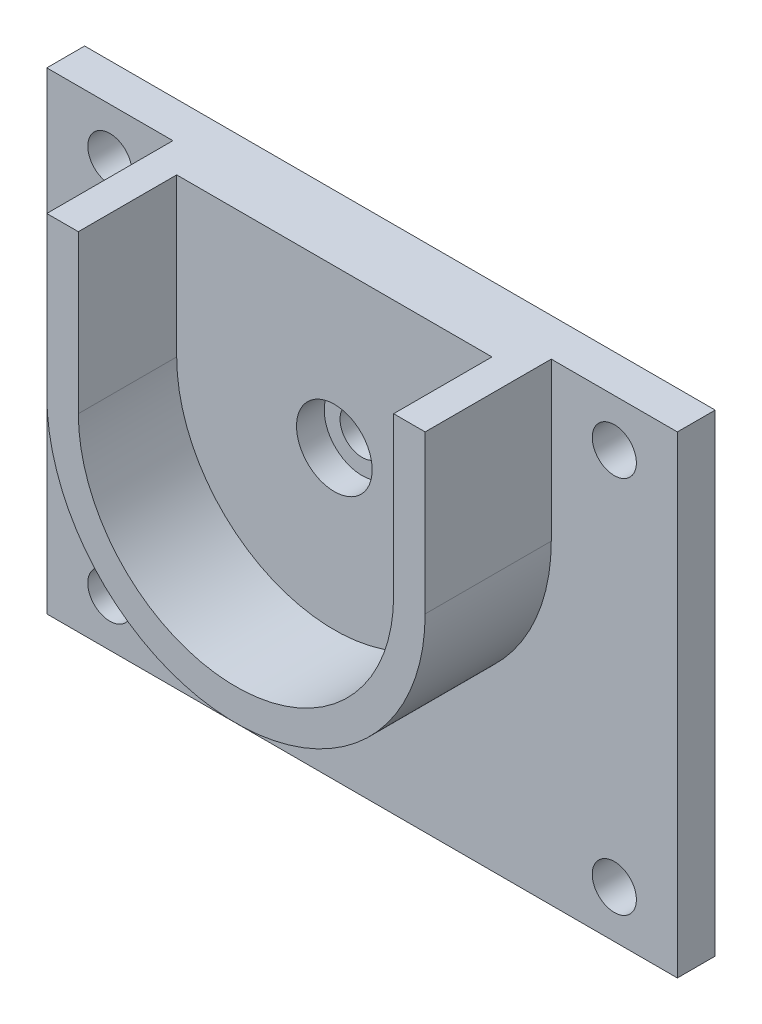
ISO-10303-21;
HEADER;
FILE_DESCRIPTION(('STEP AP214'),'2;1');
FILE_NAME('part.step','',(''),(''),'','','');
FILE_SCHEMA(('AUTOMOTIVE_DESIGN { 1 0 10303 214 1 1 1 1 }'));
ENDSEC;
DATA;
#1=APPLICATION_CONTEXT('core data for automotive mechanical design processes');
#2=APPLICATION_PROTOCOL_DEFINITION('international standard','automotive_design',2000,#1);
#3=PRODUCT_CONTEXT('',#1,'mechanical');
#4=PRODUCT('Part','Part','',(#3));
#5=PRODUCT_RELATED_PRODUCT_CATEGORY('part','',(#4));
#6=PRODUCT_DEFINITION_FORMATION('','',#4);
#7=PRODUCT_DEFINITION_CONTEXT('part definition',#1,'design');
#8=PRODUCT_DEFINITION('design','',#6,#7);
#9=PRODUCT_DEFINITION_SHAPE('','',#8);
#10=(LENGTH_UNIT() NAMED_UNIT(*) SI_UNIT(.MILLI.,.METRE.));
#11=(NAMED_UNIT(*) PLANE_ANGLE_UNIT() SI_UNIT($,.RADIAN.));
#12=(NAMED_UNIT(*) SI_UNIT($,.STERADIAN.) SOLID_ANGLE_UNIT());
#13=UNCERTAINTY_MEASURE_WITH_UNIT(LENGTH_MEASURE(1.E-05),#10,'distance_accuracy_value','');
#14=(GEOMETRIC_REPRESENTATION_CONTEXT(3) GLOBAL_UNCERTAINTY_ASSIGNED_CONTEXT((#13)) GLOBAL_UNIT_ASSIGNED_CONTEXT((#10,
#11,#12)) REPRESENTATION_CONTEXT('',''));
#15=CARTESIAN_POINT('',(0.,0.,0.));
#16=DIRECTION('',(0.,0.,1.));
#17=DIRECTION('',(1.,0.,0.));
#18=AXIS2_PLACEMENT_3D('',#15,#16,#17);
#19=CARTESIAN_POINT('',(0.,0.,3.));
#20=DIRECTION('',(0.,0.,1.));
#21=DIRECTION('',(1.,0.,0.));
#22=AXIS2_PLACEMENT_3D('',#19,#20,#21);
#23=PLANE('',#22);
#24=CARTESIAN_POINT('',(0.,0.,3.));
#25=DIRECTION('',(0.,0.,1.));
#26=DIRECTION('',(1.,0.,0.));
#27=AXIS2_PLACEMENT_3D('',#24,#25,#26);
#28=CIRCLE('',#27,1.75);
#29=CARTESIAN_POINT('',(1.75,0.,3.));
#30=VERTEX_POINT('',#29);
#31=EDGE_CURVE('E196',#30,#30,#28,.T.);
#32=ORIENTED_EDGE('',*,*,#31,.F.);
#33=EDGE_LOOP('',(#32));
#34=FACE_BOUND('',#33,.T.);
#35=CARTESIAN_POINT('',(0.,0.,3.));
#36=DIRECTION('',(0.,0.,1.));
#37=DIRECTION('',(1.,0.,0.));
#38=AXIS2_PLACEMENT_3D('',#35,#36,#37);
#39=CIRCLE('',#38,3.);
#40=CARTESIAN_POINT('',(3.,0.,3.));
#41=VERTEX_POINT('',#40);
#42=EDGE_CURVE('E11',#41,#41,#39,.F.);
#43=ORIENTED_EDGE('',*,*,#42,.F.);
#44=EDGE_LOOP('',(#43));
#45=FACE_BOUND('',#44,.T.);
#46=ADVANCED_FACE('F41',(#34,#45),#23,.T.);
#47=DIRECTION('',(0.,1.,0.));
#48=VECTOR('',#47,1.);
#49=CARTESIAN_POINT('',(15.,0.,3.));
#50=LINE('',#49,#48);
#51=CARTESIAN_POINT('',(15.,0.,3.));
#52=VERTEX_POINT('',#51);
#53=CARTESIAN_POINT('',(15.,12.5,3.));
#54=VERTEX_POINT('',#53);
#55=EDGE_CURVE('E148',#52,#54,#50,.T.);
#56=ORIENTED_EDGE('',*,*,#55,.F.);
#57=CARTESIAN_POINT('',(0.,0.,3.));
#58=DIRECTION('',(0.,0.,1.));
#59=DIRECTION('',(1.,0.,0.));
#60=AXIS2_PLACEMENT_3D('',#57,#58,#59);
#61=CIRCLE('',#60,15.);
#62=CARTESIAN_POINT('',(-15.,0.,3.));
#63=VERTEX_POINT('',#62);
#64=EDGE_CURVE('E291',#63,#52,#61,.T.);
#65=ORIENTED_EDGE('',*,*,#64,.F.);
#66=DIRECTION('',(0.,-1.,0.));
#67=VECTOR('',#66,1.);
#68=CARTESIAN_POINT('',(-15.,0.,3.));
#69=LINE('',#68,#67);
#70=CARTESIAN_POINT('',(-15.,12.5,3.));
#71=VERTEX_POINT('',#70);
#72=EDGE_CURVE('E267',#71,#63,#69,.T.);
#73=ORIENTED_EDGE('',*,*,#72,.F.);
#74=DIRECTION('',(1.,0.,0.));
#75=VECTOR('',#74,1.);
#76=CARTESIAN_POINT('',(0.,12.5,3.));
#77=LINE('',#76,#75);
#78=CARTESIAN_POINT('',(-25.,12.5,3.));
#79=VERTEX_POINT('',#78);
#80=EDGE_CURVE('E185',#79,#71,#77,.T.);
#81=ORIENTED_EDGE('',*,*,#80,.F.);
#82=DIRECTION('',(0.,-1.,0.));
#83=VECTOR('',#82,1.);
#84=CARTESIAN_POINT('',(-25.,0.,3.));
#85=LINE('',#84,#83);
#86=CARTESIAN_POINT('',(-25.,-25.,3.));
#87=VERTEX_POINT('',#86);
#88=EDGE_CURVE('E189',#79,#87,#85,.T.);
#89=ORIENTED_EDGE('',*,*,#88,.T.);
#90=DIRECTION('',(1.,0.,0.));
#91=VECTOR('',#90,1.);
#92=CARTESIAN_POINT('',(0.,-25.,3.));
#93=LINE('',#92,#91);
#94=CARTESIAN_POINT('',(25.,-25.,3.));
#95=VERTEX_POINT('',#94);
#96=EDGE_CURVE('E193',#87,#95,#93,.T.);
#97=ORIENTED_EDGE('',*,*,#96,.T.);
#98=DIRECTION('',(0.,-1.,0.));
#99=VECTOR('',#98,1.);
#100=CARTESIAN_POINT('',(25.,0.,3.));
#101=LINE('',#100,#99);
#102=CARTESIAN_POINT('',(25.,12.5,3.));
#103=VERTEX_POINT('',#102);
#104=EDGE_CURVE('E180',#103,#95,#101,.T.);
#105=ORIENTED_EDGE('',*,*,#104,.F.);
#106=EDGE_CURVE('E184',#54,#103,#77,.T.);
#107=ORIENTED_EDGE('',*,*,#106,.F.);
#108=EDGE_LOOP('',(#56,#65,#73,#81,#89,#97,#105,#107));
#109=FACE_BOUND('',#108,.T.);
#110=CARTESIAN_POINT('',(-20.,8.75,3.));
#111=DIRECTION('',(0.,0.,1.));
#112=DIRECTION('',(1.,0.,0.));
#113=AXIS2_PLACEMENT_3D('',#110,#111,#112);
#114=CIRCLE('',#113,1.75);
#115=CARTESIAN_POINT('',(-18.25,8.75,3.));
#116=VERTEX_POINT('',#115);
#117=EDGE_CURVE('E176',#116,#116,#114,.T.);
#118=ORIENTED_EDGE('',*,*,#117,.F.);
#119=EDGE_LOOP('',(#118));
#120=FACE_BOUND('',#119,.T.);
#121=CARTESIAN_POINT('',(-20.,-21.25,3.));
#122=DIRECTION('',(0.,0.,1.));
#123=DIRECTION('',(1.,0.,0.));
#124=AXIS2_PLACEMENT_3D('',#121,#122,#123);
#125=CIRCLE('',#124,1.75);
#126=CARTESIAN_POINT('',(-18.25,-21.25,3.));
#127=VERTEX_POINT('',#126);
#128=EDGE_CURVE('E172',#127,#127,#125,.T.);
#129=ORIENTED_EDGE('',*,*,#128,.F.);
#130=EDGE_LOOP('',(#129));
#131=FACE_BOUND('',#130,.T.);
#132=CARTESIAN_POINT('',(20.,-21.25,3.));
#133=DIRECTION('',(0.,0.,1.));
#134=DIRECTION('',(1.,0.,0.));
#135=AXIS2_PLACEMENT_3D('',#132,#133,#134);
#136=CIRCLE('',#135,1.75);
#137=CARTESIAN_POINT('',(21.75,-21.25,3.));
#138=VERTEX_POINT('',#137);
#139=EDGE_CURVE('E167',#138,#138,#136,.T.);
#140=ORIENTED_EDGE('',*,*,#139,.F.);
#141=EDGE_LOOP('',(#140));
#142=FACE_BOUND('',#141,.T.);
#143=CARTESIAN_POINT('',(20.,8.75,3.));
#144=DIRECTION('',(0.,0.,1.));
#145=DIRECTION('',(1.,0.,0.));
#146=AXIS2_PLACEMENT_3D('',#143,#144,#145);
#147=CIRCLE('',#146,1.75);
#148=CARTESIAN_POINT('',(21.75,8.75,3.));
#149=VERTEX_POINT('',#148);
#150=EDGE_CURVE('E163',#149,#149,#147,.T.);
#151=ORIENTED_EDGE('',*,*,#150,.F.);
#152=EDGE_LOOP('',(#151));
#153=FACE_BOUND('',#152,.T.);
#154=ADVANCED_FACE('F344',(#109,#120,#131,#142,#153),#23,.T.);
#155=CARTESIAN_POINT('',(25.,0.,3.));
#156=DIRECTION('',(1.,0.,0.));
#157=DIRECTION('',(0.,1.,0.));
#158=AXIS2_PLACEMENT_3D('',#155,#156,#157);
#159=PLANE('',#158);
#160=DIRECTION('',(0.,-1.,0.));
#161=VECTOR('',#160,1.);
#162=CARTESIAN_POINT('',(25.,0.,0.));
#163=LINE('',#162,#161);
#164=CARTESIAN_POINT('',(25.,12.5,0.));
#165=VERTEX_POINT('',#164);
#166=CARTESIAN_POINT('',(25.,-25.,0.));
#167=VERTEX_POINT('',#166);
#168=EDGE_CURVE('E212',#165,#167,#163,.T.);
#169=ORIENTED_EDGE('',*,*,#168,.F.);
#170=DIRECTION('',(0.,0.,-1.));
#171=VECTOR('',#170,1.);
#172=CARTESIAN_POINT('',(25.,12.5,3.));
#173=LINE('',#172,#171);
#174=EDGE_CURVE('E50',#103,#165,#173,.T.);
#175=ORIENTED_EDGE('',*,*,#174,.F.);
#176=ORIENTED_EDGE('',*,*,#104,.T.);
#177=DIRECTION('',(0.,0.,-1.));
#178=VECTOR('',#177,1.);
#179=CARTESIAN_POINT('',(25.,-25.,3.));
#180=LINE('',#179,#178);
#181=EDGE_CURVE('E199',#95,#167,#180,.T.);
#182=ORIENTED_EDGE('',*,*,#181,.T.);
#183=EDGE_LOOP('',(#169,#175,#176,#182));
#184=FACE_BOUND('',#183,.T.);
#185=ADVANCED_FACE('F248',(#184),#159,.T.);
#186=CARTESIAN_POINT('',(0.,12.5,3.));
#187=DIRECTION('',(0.,1.,0.));
#188=DIRECTION('',(-1.,0.,0.));
#189=AXIS2_PLACEMENT_3D('',#186,#187,#188);
#190=PLANE('',#189);
#191=DIRECTION('',(1.,0.,0.));
#192=VECTOR('',#191,1.);
#193=CARTESIAN_POINT('',(0.,12.5,0.));
#194=LINE('',#193,#192);
#195=CARTESIAN_POINT('',(-25.,12.5,0.));
#196=VERTEX_POINT('',#195);
#197=EDGE_CURVE('E216',#196,#165,#194,.T.);
#198=ORIENTED_EDGE('',*,*,#197,.F.);
#199=DIRECTION('',(0.,0.,-1.));
#200=VECTOR('',#199,1.);
#201=CARTESIAN_POINT('',(-25.,12.5,3.));
#202=LINE('',#201,#200);
#203=EDGE_CURVE('E237',#79,#196,#202,.T.);
#204=ORIENTED_EDGE('',*,*,#203,.F.);
#205=ORIENTED_EDGE('',*,*,#80,.T.);
#206=DIRECTION('',(0.,0.,-1.));
#207=VECTOR('',#206,1.);
#208=CARTESIAN_POINT('',(-15.,12.5,13.));
#209=LINE('',#208,#207);
#210=CARTESIAN_POINT('',(-15.,12.5,13.));
#211=VERTEX_POINT('',#210);
#212=EDGE_CURVE('E159',#211,#71,#209,.T.);
#213=ORIENTED_EDGE('',*,*,#212,.F.);
#214=DIRECTION('',(-1.,0.,0.));
#215=VECTOR('',#214,1.);
#216=CARTESIAN_POINT('',(-12.5,12.5,13.));
#217=LINE('',#216,#215);
#218=CARTESIAN_POINT('',(-12.5,12.5,13.));
#219=VERTEX_POINT('',#218);
#220=EDGE_CURVE('E139',#219,#211,#217,.T.);
#221=ORIENTED_EDGE('',*,*,#220,.F.);
#222=DIRECTION('',(0.,0.,-1.));
#223=VECTOR('',#222,1.);
#224=CARTESIAN_POINT('',(-12.5,12.5,13.));
#225=LINE('',#224,#223);
#226=CARTESIAN_POINT('',(-12.5,12.5,5.2));
#227=VERTEX_POINT('',#226);
#228=EDGE_CURVE('E135',#219,#227,#225,.T.);
#229=ORIENTED_EDGE('',*,*,#228,.T.);
#230=DIRECTION('',(-1.,0.,0.));
#231=VECTOR('',#230,1.);
#232=CARTESIAN_POINT('',(12.5,12.5,5.2));
#233=LINE('',#232,#231);
#234=CARTESIAN_POINT('',(12.5,12.5,5.2));
#235=VERTEX_POINT('',#234);
#236=EDGE_CURVE('E314',#235,#227,#233,.T.);
#237=ORIENTED_EDGE('',*,*,#236,.F.);
#238=DIRECTION('',(0.,0.,-1.));
#239=VECTOR('',#238,1.);
#240=CARTESIAN_POINT('',(12.5,12.5,13.));
#241=LINE('',#240,#239);
#242=CARTESIAN_POINT('',(12.5,12.5,13.));
#243=VERTEX_POINT('',#242);
#244=EDGE_CURVE('E282',#243,#235,#241,.T.);
#245=ORIENTED_EDGE('',*,*,#244,.F.);
#246=DIRECTION('',(-1.,0.,0.));
#247=VECTOR('',#246,1.);
#248=CARTESIAN_POINT('',(12.5,12.5,13.));
#249=LINE('',#248,#247);
#250=CARTESIAN_POINT('',(15.,12.5,13.));
#251=VERTEX_POINT('',#250);
#252=EDGE_CURVE('E299',#251,#243,#249,.T.);
#253=ORIENTED_EDGE('',*,*,#252,.F.);
#254=DIRECTION('',(0.,0.,-1.));
#255=VECTOR('',#254,1.);
#256=CARTESIAN_POINT('',(15.,12.5,13.));
#257=LINE('',#256,#255);
#258=EDGE_CURVE('E279',#251,#54,#257,.T.);
#259=ORIENTED_EDGE('',*,*,#258,.T.);
#260=ORIENTED_EDGE('',*,*,#106,.T.);
#261=ORIENTED_EDGE('',*,*,#174,.T.);
#262=EDGE_LOOP('',(#198,#204,#205,#213,#221,#229,#237,#245,#253,#259,#260,#261));
#263=FACE_BOUND('',#262,.T.);
#264=ADVANCED_FACE('F244',(#263),#190,.T.);
#265=CARTESIAN_POINT('',(-25.,0.,3.));
#266=DIRECTION('',(1.,0.,0.));
#267=DIRECTION('',(0.,0.,-1.));
#268=AXIS2_PLACEMENT_3D('',#265,#266,#267);
#269=PLANE('',#268);
#270=DIRECTION('',(0.,-1.,0.));
#271=VECTOR('',#270,1.);
#272=CARTESIAN_POINT('',(-25.,0.,0.));
#273=LINE('',#272,#271);
#274=CARTESIAN_POINT('',(-25.,-25.,0.));
#275=VERTEX_POINT('',#274);
#276=EDGE_CURVE('E220',#196,#275,#273,.T.);
#277=ORIENTED_EDGE('',*,*,#276,.T.);
#278=DIRECTION('',(0.,0.,-1.));
#279=VECTOR('',#278,1.);
#280=CARTESIAN_POINT('',(-25.,-25.,3.));
#281=LINE('',#280,#279);
#282=EDGE_CURVE('E233',#87,#275,#281,.T.);
#283=ORIENTED_EDGE('',*,*,#282,.F.);
#284=ORIENTED_EDGE('',*,*,#88,.F.);
#285=ORIENTED_EDGE('',*,*,#203,.T.);
#286=EDGE_LOOP('',(#277,#283,#284,#285));
#287=FACE_BOUND('',#286,.T.);
#288=ADVANCED_FACE('F256',(#287),#269,.F.);
#289=CARTESIAN_POINT('',(0.,-25.,3.));
#290=DIRECTION('',(0.,1.,0.));
#291=DIRECTION('',(-1.,0.,0.));
#292=AXIS2_PLACEMENT_3D('',#289,#290,#291);
#293=PLANE('',#292);
#294=DIRECTION('',(1.,0.,0.));
#295=VECTOR('',#294,1.);
#296=CARTESIAN_POINT('',(0.,-25.,0.));
#297=LINE('',#296,#295);
#298=EDGE_CURVE('E224',#275,#167,#297,.T.);
#299=ORIENTED_EDGE('',*,*,#298,.T.);
#300=ORIENTED_EDGE('',*,*,#181,.F.);
#301=ORIENTED_EDGE('',*,*,#96,.F.);
#302=ORIENTED_EDGE('',*,*,#282,.T.);
#303=EDGE_LOOP('',(#299,#300,#301,#302));
#304=FACE_BOUND('',#303,.T.);
#305=ADVANCED_FACE('F362',(#304),#293,.F.);
#306=CARTESIAN_POINT('',(-20.,8.75,3.));
#307=DIRECTION('',(0.,0.,-1.));
#308=DIRECTION('',(-1.,0.,0.));
#309=AXIS2_PLACEMENT_3D('',#306,#307,#308);
#310=CYLINDRICAL_SURFACE('',#309,1.75);
#311=ORIENTED_EDGE('',*,*,#117,.T.);
#312=EDGE_LOOP('',(#311));
#313=FACE_BOUND('',#312,.T.);
#314=CARTESIAN_POINT('',(-20.,8.75,0.));
#315=DIRECTION('',(0.,0.,1.));
#316=DIRECTION('',(1.,0.,0.));
#317=AXIS2_PLACEMENT_3D('',#314,#315,#316);
#318=CIRCLE('',#317,1.75);
#319=CARTESIAN_POINT('',(-18.25,8.75,0.));
#320=VERTEX_POINT('',#319);
#321=EDGE_CURVE('E208',#320,#320,#318,.T.);
#322=ORIENTED_EDGE('',*,*,#321,.F.);
#323=EDGE_LOOP('',(#322));
#324=FACE_BOUND('',#323,.T.);
#325=ADVANCED_FACE('F365',(#313,#324),#310,.F.);
#326=CARTESIAN_POINT('',(-20.,-21.25,3.));
#327=DIRECTION('',(0.,0.,-1.));
#328=DIRECTION('',(-1.,0.,0.));
#329=AXIS2_PLACEMENT_3D('',#326,#327,#328);
#330=CYLINDRICAL_SURFACE('',#329,1.75);
#331=ORIENTED_EDGE('',*,*,#128,.T.);
#332=EDGE_LOOP('',(#331));
#333=FACE_BOUND('',#332,.T.);
#334=CARTESIAN_POINT('',(-20.,-21.25,0.));
#335=DIRECTION('',(0.,0.,1.));
#336=DIRECTION('',(1.,0.,0.));
#337=AXIS2_PLACEMENT_3D('',#334,#335,#336);
#338=CIRCLE('',#337,1.75);
#339=CARTESIAN_POINT('',(-18.25,-21.25,0.));
#340=VERTEX_POINT('',#339);
#341=EDGE_CURVE('E204',#340,#340,#338,.T.);
#342=ORIENTED_EDGE('',*,*,#341,.F.);
#343=EDGE_LOOP('',(#342));
#344=FACE_BOUND('',#343,.T.);
#345=ADVANCED_FACE('F375',(#333,#344),#330,.F.);
#346=CARTESIAN_POINT('',(20.,-21.25,3.));
#347=DIRECTION('',(0.,0.,-1.));
#348=DIRECTION('',(-1.,0.,0.));
#349=AXIS2_PLACEMENT_3D('',#346,#347,#348);
#350=CYLINDRICAL_SURFACE('',#349,1.75);
#351=ORIENTED_EDGE('',*,*,#139,.T.);
#352=EDGE_LOOP('',(#351));
#353=FACE_BOUND('',#352,.T.);
#354=CARTESIAN_POINT('',(20.,-21.25,0.));
#355=DIRECTION('',(0.,0.,1.));
#356=DIRECTION('',(1.,0.,0.));
#357=AXIS2_PLACEMENT_3D('',#354,#355,#356);
#358=CIRCLE('',#357,1.75);
#359=CARTESIAN_POINT('',(21.75,-21.25,0.));
#360=VERTEX_POINT('',#359);
#361=EDGE_CURVE('E157',#360,#360,#358,.T.);
#362=ORIENTED_EDGE('',*,*,#361,.F.);
#363=EDGE_LOOP('',(#362));
#364=FACE_BOUND('',#363,.T.);
#365=ADVANCED_FACE('F378',(#353,#364),#350,.F.);
#366=CARTESIAN_POINT('',(20.,8.75,3.));
#367=DIRECTION('',(0.,0.,-1.));
#368=DIRECTION('',(-1.,0.,0.));
#369=AXIS2_PLACEMENT_3D('',#366,#367,#368);
#370=CYLINDRICAL_SURFACE('',#369,1.75);
#371=ORIENTED_EDGE('',*,*,#150,.T.);
#372=EDGE_LOOP('',(#371));
#373=FACE_BOUND('',#372,.T.);
#374=CARTESIAN_POINT('',(20.,8.75,0.));
#375=DIRECTION('',(0.,0.,1.));
#376=DIRECTION('',(1.,0.,0.));
#377=AXIS2_PLACEMENT_3D('',#374,#375,#376);
#378=CIRCLE('',#377,1.75);
#379=CARTESIAN_POINT('',(21.75,8.75,0.));
#380=VERTEX_POINT('',#379);
#381=EDGE_CURVE('E152',#380,#380,#378,.T.);
#382=ORIENTED_EDGE('',*,*,#381,.F.);
#383=EDGE_LOOP('',(#382));
#384=FACE_BOUND('',#383,.T.);
#385=ADVANCED_FACE('F43',(#373,#384),#370,.F.);
#386=CARTESIAN_POINT('',(0.,0.,3.));
#387=DIRECTION('',(0.,0.,-1.));
#388=DIRECTION('',(-1.,0.,0.));
#389=AXIS2_PLACEMENT_3D('',#386,#387,#388);
#390=CYLINDRICAL_SURFACE('',#389,1.75);
#391=ORIENTED_EDGE('',*,*,#31,.T.);
#392=EDGE_LOOP('',(#391));
#393=FACE_BOUND('',#392,.T.);
#394=CARTESIAN_POINT('',(0.,0.,0.));
#395=DIRECTION('',(0.,0.,1.));
#396=DIRECTION('',(1.,0.,0.));
#397=AXIS2_PLACEMENT_3D('',#394,#395,#396);
#398=CIRCLE('',#397,1.75);
#399=CARTESIAN_POINT('',(1.75,0.,0.));
#400=VERTEX_POINT('',#399);
#401=EDGE_CURVE('E168',#400,#400,#398,.T.);
#402=ORIENTED_EDGE('',*,*,#401,.F.);
#403=EDGE_LOOP('',(#402));
#404=FACE_BOUND('',#403,.T.);
#405=ADVANCED_FACE('F357',(#393,#404),#390,.F.);
#406=CARTESIAN_POINT('',(0.,0.,0.));
#407=DIRECTION('',(0.,0.,1.));
#408=DIRECTION('',(1.,0.,0.));
#409=AXIS2_PLACEMENT_3D('',#406,#407,#408);
#410=PLANE('',#409);
#411=ORIENTED_EDGE('',*,*,#381,.T.);
#412=EDGE_LOOP('',(#411));
#413=FACE_BOUND('',#412,.T.);
#414=ORIENTED_EDGE('',*,*,#361,.T.);
#415=EDGE_LOOP('',(#414));
#416=FACE_BOUND('',#415,.T.);
#417=ORIENTED_EDGE('',*,*,#341,.T.);
#418=EDGE_LOOP('',(#417));
#419=FACE_BOUND('',#418,.T.);
#420=ORIENTED_EDGE('',*,*,#321,.T.);
#421=EDGE_LOOP('',(#420));
#422=FACE_BOUND('',#421,.T.);
#423=ORIENTED_EDGE('',*,*,#168,.T.);
#424=ORIENTED_EDGE('',*,*,#298,.F.);
#425=ORIENTED_EDGE('',*,*,#276,.F.);
#426=ORIENTED_EDGE('',*,*,#197,.T.);
#427=EDGE_LOOP('',(#423,#424,#425,#426));
#428=FACE_BOUND('',#427,.T.);
#429=ORIENTED_EDGE('',*,*,#401,.T.);
#430=EDGE_LOOP('',(#429));
#431=FACE_BOUND('',#430,.T.);
#432=ADVANCED_FACE('F252',(#413,#416,#419,#422,#428,#431),#410,.F.);
#433=CARTESIAN_POINT('',(0.,0.,13.));
#434=DIRECTION('',(0.,0.,-1.));
#435=DIRECTION('',(-1.,0.,0.));
#436=AXIS2_PLACEMENT_3D('',#433,#434,#435);
#437=CYLINDRICAL_SURFACE('',#436,12.5);
#438=DIRECTION('',(0.,0.,-1.));
#439=VECTOR('',#438,1.);
#440=CARTESIAN_POINT('',(12.5,0.,13.));
#441=LINE('',#440,#439);
#442=CARTESIAN_POINT('',(12.5,0.,13.));
#443=VERTEX_POINT('',#442);
#444=CARTESIAN_POINT('',(12.5,0.,5.2));
#445=VERTEX_POINT('',#444);
#446=EDGE_CURVE('E285',#443,#445,#441,.T.);
#447=ORIENTED_EDGE('',*,*,#446,.T.);
#448=CARTESIAN_POINT('',(0.,0.,5.2));
#449=DIRECTION('',(0.,0.,1.));
#450=DIRECTION('',(1.,0.,0.));
#451=AXIS2_PLACEMENT_3D('',#448,#449,#450);
#452=CIRCLE('',#451,12.5);
#453=CARTESIAN_POINT('',(-12.5,0.,5.2));
#454=VERTEX_POINT('',#453);
#455=EDGE_CURVE('E57',#454,#445,#452,.T.);
#456=ORIENTED_EDGE('',*,*,#455,.F.);
#457=DIRECTION('',(0.,0.,-1.));
#458=VECTOR('',#457,1.);
#459=CARTESIAN_POINT('',(-12.5,0.,13.));
#460=LINE('',#459,#458);
#461=CARTESIAN_POINT('',(-12.5,0.,13.));
#462=VERTEX_POINT('',#461);
#463=EDGE_CURVE('E134',#462,#454,#460,.T.);
#464=ORIENTED_EDGE('',*,*,#463,.F.);
#465=CARTESIAN_POINT('',(0.,0.,13.));
#466=DIRECTION('',(0.,0.,-1.));
#467=DIRECTION('',(1.,0.,0.));
#468=AXIS2_PLACEMENT_3D('',#465,#466,#467);
#469=CIRCLE('',#468,12.5);
#470=EDGE_CURVE('E140',#443,#462,#469,.T.);
#471=ORIENTED_EDGE('',*,*,#470,.F.);
#472=EDGE_LOOP('',(#447,#456,#464,#471));
#473=FACE_BOUND('',#472,.T.);
#474=ADVANCED_FACE('F150',(#473),#437,.F.);
#475=CARTESIAN_POINT('',(-12.5,0.,13.));
#476=DIRECTION('',(-1.,0.,0.));
#477=DIRECTION('',(0.,0.,1.));
#478=AXIS2_PLACEMENT_3D('',#475,#476,#477);
#479=PLANE('',#478);
#480=ORIENTED_EDGE('',*,*,#463,.T.);
#481=DIRECTION('',(0.,-1.,0.));
#482=VECTOR('',#481,1.);
#483=CARTESIAN_POINT('',(-12.5,12.5,5.2));
#484=LINE('',#483,#482);
#485=EDGE_CURVE('E64',#227,#454,#484,.T.);
#486=ORIENTED_EDGE('',*,*,#485,.F.);
#487=ORIENTED_EDGE('',*,*,#228,.F.);
#488=DIRECTION('',(0.,1.,0.));
#489=VECTOR('',#488,1.);
#490=CARTESIAN_POINT('',(-12.5,0.,13.));
#491=LINE('',#490,#489);
#492=EDGE_CURVE('E131',#462,#219,#491,.T.);
#493=ORIENTED_EDGE('',*,*,#492,.F.);
#494=EDGE_LOOP('',(#480,#486,#487,#493));
#495=FACE_BOUND('',#494,.T.);
#496=ADVANCED_FACE('F133',(#495),#479,.F.);
#497=CARTESIAN_POINT('',(-15.,0.,13.));
#498=DIRECTION('',(1.,0.,0.));
#499=DIRECTION('',(0.,0.,-1.));
#500=AXIS2_PLACEMENT_3D('',#497,#498,#499);
#501=PLANE('',#500);
#502=ORIENTED_EDGE('',*,*,#72,.T.);
#503=DIRECTION('',(0.,0.,-1.));
#504=VECTOR('',#503,1.);
#505=CARTESIAN_POINT('',(-15.,0.,13.));
#506=LINE('',#505,#504);
#507=CARTESIAN_POINT('',(-15.,0.,13.));
#508=VERTEX_POINT('',#507);
#509=EDGE_CURVE('E271',#508,#63,#506,.T.);
#510=ORIENTED_EDGE('',*,*,#509,.F.);
#511=DIRECTION('',(0.,-1.,0.));
#512=VECTOR('',#511,1.);
#513=CARTESIAN_POINT('',(-15.,0.,13.));
#514=LINE('',#513,#512);
#515=EDGE_CURVE('E269',#211,#508,#514,.T.);
#516=ORIENTED_EDGE('',*,*,#515,.F.);
#517=ORIENTED_EDGE('',*,*,#212,.T.);
#518=EDGE_LOOP('',(#502,#510,#516,#517));
#519=FACE_BOUND('',#518,.T.);
#520=ADVANCED_FACE('F265',(#519),#501,.F.);
#521=CARTESIAN_POINT('',(0.,0.,13.));
#522=DIRECTION('',(0.,0.,-1.));
#523=DIRECTION('',(-1.,0.,0.));
#524=AXIS2_PLACEMENT_3D('',#521,#522,#523);
#525=CYLINDRICAL_SURFACE('',#524,15.);
#526=ORIENTED_EDGE('',*,*,#64,.T.);
#527=DIRECTION('',(0.,0.,-1.));
#528=VECTOR('',#527,1.);
#529=CARTESIAN_POINT('',(15.,0.,13.));
#530=LINE('',#529,#528);
#531=CARTESIAN_POINT('',(15.,0.,13.));
#532=VERTEX_POINT('',#531);
#533=EDGE_CURVE('E273',#532,#52,#530,.T.);
#534=ORIENTED_EDGE('',*,*,#533,.F.);
#535=CARTESIAN_POINT('',(0.,0.,13.));
#536=DIRECTION('',(0.,0.,1.));
#537=DIRECTION('',(1.,0.,0.));
#538=AXIS2_PLACEMENT_3D('',#535,#536,#537);
#539=CIRCLE('',#538,15.);
#540=EDGE_CURVE('E305',#508,#532,#539,.T.);
#541=ORIENTED_EDGE('',*,*,#540,.F.);
#542=ORIENTED_EDGE('',*,*,#509,.T.);
#543=EDGE_LOOP('',(#526,#534,#541,#542));
#544=FACE_BOUND('',#543,.T.);
#545=ADVANCED_FACE('F430',(#544),#525,.T.);
#546=CARTESIAN_POINT('',(15.,0.,13.));
#547=DIRECTION('',(-1.,0.,0.));
#548=DIRECTION('',(0.,0.,1.));
#549=AXIS2_PLACEMENT_3D('',#546,#547,#548);
#550=PLANE('',#549);
#551=ORIENTED_EDGE('',*,*,#55,.T.);
#552=ORIENTED_EDGE('',*,*,#258,.F.);
#553=DIRECTION('',(0.,1.,0.));
#554=VECTOR('',#553,1.);
#555=CARTESIAN_POINT('',(15.,0.,13.));
#556=LINE('',#555,#554);
#557=EDGE_CURVE('E302',#532,#251,#556,.T.);
#558=ORIENTED_EDGE('',*,*,#557,.F.);
#559=ORIENTED_EDGE('',*,*,#533,.T.);
#560=EDGE_LOOP('',(#551,#552,#558,#559));
#561=FACE_BOUND('',#560,.T.);
#562=ADVANCED_FACE('F437',(#561),#550,.F.);
#563=CARTESIAN_POINT('',(12.5,0.,13.));
#564=DIRECTION('',(1.,0.,0.));
#565=DIRECTION('',(0.,1.,0.));
#566=AXIS2_PLACEMENT_3D('',#563,#564,#565);
#567=PLANE('',#566);
#568=ORIENTED_EDGE('',*,*,#244,.T.);
#569=DIRECTION('',(0.,1.,0.));
#570=VECTOR('',#569,1.);
#571=CARTESIAN_POINT('',(12.5,0.,5.2));
#572=LINE('',#571,#570);
#573=EDGE_CURVE('E318',#445,#235,#572,.T.);
#574=ORIENTED_EDGE('',*,*,#573,.F.);
#575=ORIENTED_EDGE('',*,*,#446,.F.);
#576=DIRECTION('',(0.,-1.,0.));
#577=VECTOR('',#576,1.);
#578=CARTESIAN_POINT('',(12.5,0.,13.));
#579=LINE('',#578,#577);
#580=EDGE_CURVE('E145',#243,#443,#579,.T.);
#581=ORIENTED_EDGE('',*,*,#580,.F.);
#582=EDGE_LOOP('',(#568,#574,#575,#581));
#583=FACE_BOUND('',#582,.T.);
#584=ADVANCED_FACE('F341',(#583),#567,.F.);
#585=CARTESIAN_POINT('',(0.,0.,13.));
#586=DIRECTION('',(0.,0.,1.));
#587=DIRECTION('',(1.,0.,0.));
#588=AXIS2_PLACEMENT_3D('',#585,#586,#587);
#589=PLANE('',#588);
#590=ORIENTED_EDGE('',*,*,#470,.T.);
#591=ORIENTED_EDGE('',*,*,#492,.T.);
#592=ORIENTED_EDGE('',*,*,#220,.T.);
#593=ORIENTED_EDGE('',*,*,#515,.T.);
#594=ORIENTED_EDGE('',*,*,#540,.T.);
#595=ORIENTED_EDGE('',*,*,#557,.T.);
#596=ORIENTED_EDGE('',*,*,#252,.T.);
#597=ORIENTED_EDGE('',*,*,#580,.T.);
#598=EDGE_LOOP('',(#590,#591,#592,#593,#594,#595,#596,#597));
#599=FACE_BOUND('',#598,.T.);
#600=ADVANCED_FACE('F143',(#599),#589,.T.);
#601=CARTESIAN_POINT('',(0.,0.,5.2));
#602=DIRECTION('',(0.,0.,1.));
#603=DIRECTION('',(1.,0.,0.));
#604=AXIS2_PLACEMENT_3D('',#601,#602,#603);
#605=PLANE('',#604);
#606=ORIENTED_EDGE('',*,*,#455,.T.);
#607=ORIENTED_EDGE('',*,*,#573,.T.);
#608=ORIENTED_EDGE('',*,*,#236,.T.);
#609=ORIENTED_EDGE('',*,*,#485,.T.);
#610=EDGE_LOOP('',(#606,#607,#608,#609));
#611=FACE_BOUND('',#610,.T.);
#612=CARTESIAN_POINT('',(0.,0.,5.2));
#613=DIRECTION('',(0.,0.,1.));
#614=DIRECTION('',(1.,0.,0.));
#615=AXIS2_PLACEMENT_3D('',#612,#613,#614);
#616=CIRCLE('',#615,3.);
#617=CARTESIAN_POINT('',(3.,0.,5.2));
#618=VERTEX_POINT('',#617);
#619=EDGE_CURVE('E324',#618,#618,#616,.T.);
#620=ORIENTED_EDGE('',*,*,#619,.F.);
#621=EDGE_LOOP('',(#620));
#622=FACE_BOUND('',#621,.T.);
#623=ADVANCED_FACE('F332',(#611,#622),#605,.T.);
#624=CARTESIAN_POINT('',(0.,0.,5.2));
#625=DIRECTION('',(0.,0.,-1.));
#626=DIRECTION('',(-1.,0.,0.));
#627=AXIS2_PLACEMENT_3D('',#624,#625,#626);
#628=CYLINDRICAL_SURFACE('',#627,3.);
#629=ORIENTED_EDGE('',*,*,#619,.T.);
#630=EDGE_LOOP('',(#629));
#631=FACE_BOUND('',#630,.T.);
#632=ORIENTED_EDGE('',*,*,#42,.T.);
#633=EDGE_LOOP('',(#632));
#634=FACE_BOUND('',#633,.T.);
#635=ADVANCED_FACE('F329',(#631,#634),#628,.F.);
#636=CLOSED_SHELL('',(#46,#154,#185,#264,#288,#305,#325,#345,#365,#385,#405,#432,#474,#496,#520,
#545,#562,#584,#600,#623,#635));
#637=MANIFOLD_SOLID_BREP('B2',#636);
#638=ADVANCED_BREP_SHAPE_REPRESENTATION('',(#18,#637),#14);
#639=SHAPE_DEFINITION_REPRESENTATION(#9,#638);
ENDSEC;
END-ISO-10303-21;
